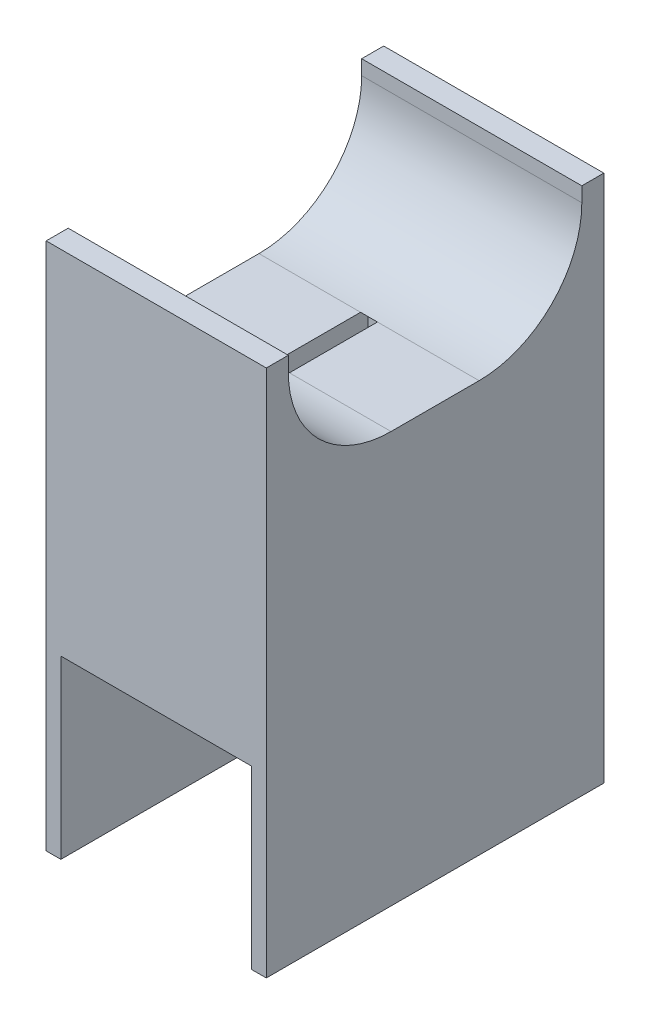
ISO-10303-21;
HEADER;
FILE_DESCRIPTION(('STEP AP214'),'2;1');
FILE_NAME('part.step','',(''),(''),'','','');
FILE_SCHEMA(('AUTOMOTIVE_DESIGN { 1 0 10303 214 1 1 1 1 }'));
ENDSEC;
DATA;
#1=APPLICATION_CONTEXT('core data for automotive mechanical design processes');
#2=APPLICATION_PROTOCOL_DEFINITION('international standard','automotive_design',2000,#1);
#3=PRODUCT_CONTEXT('',#1,'mechanical');
#4=PRODUCT('Part','Part','',(#3));
#5=PRODUCT_RELATED_PRODUCT_CATEGORY('part','',(#4));
#6=PRODUCT_DEFINITION_FORMATION('','',#4);
#7=PRODUCT_DEFINITION_CONTEXT('part definition',#1,'design');
#8=PRODUCT_DEFINITION('design','',#6,#7);
#9=PRODUCT_DEFINITION_SHAPE('','',#8);
#10=(LENGTH_UNIT() NAMED_UNIT(*) SI_UNIT(.MILLI.,.METRE.));
#11=(NAMED_UNIT(*) PLANE_ANGLE_UNIT() SI_UNIT($,.RADIAN.));
#12=(NAMED_UNIT(*) SI_UNIT($,.STERADIAN.) SOLID_ANGLE_UNIT());
#13=UNCERTAINTY_MEASURE_WITH_UNIT(LENGTH_MEASURE(1.E-05),#10,'distance_accuracy_value','');
#14=(GEOMETRIC_REPRESENTATION_CONTEXT(3) GLOBAL_UNCERTAINTY_ASSIGNED_CONTEXT((#13)) GLOBAL_UNIT_ASSIGNED_CONTEXT((#10,
#11,#12)) REPRESENTATION_CONTEXT('',''));
#15=CARTESIAN_POINT('',(0.,0.,0.));
#16=DIRECTION('',(0.,0.,1.));
#17=DIRECTION('',(1.,0.,0.));
#18=AXIS2_PLACEMENT_3D('',#15,#16,#17);
#19=CARTESIAN_POINT('',(-7.5,18.,10.));
#20=DIRECTION('',(0.,-1.,0.));
#21=DIRECTION('',(0.,0.,-1.));
#22=AXIS2_PLACEMENT_3D('',#19,#20,#21);
#23=PLANE('',#22);
#24=DIRECTION('',(1.,0.,0.));
#25=VECTOR('',#24,1.);
#26=CARTESIAN_POINT('',(-7.5,18.,-3.));
#27=LINE('',#26,#25);
#28=CARTESIAN_POINT('',(7.5,18.,-3.));
#29=VERTEX_POINT('',#28);
#30=CARTESIAN_POINT('',(0.575,18.,-3.));
#31=VERTEX_POINT('',#30);
#32=EDGE_CURVE('E363',#29,#31,#27,.F.);
#33=ORIENTED_EDGE('',*,*,#32,.T.);
#34=DIRECTION('',(0.,0.,1.));
#35=VECTOR('',#34,1.);
#36=CARTESIAN_POINT('',(0.575,18.,-3.5));
#37=LINE('',#36,#35);
#38=CARTESIAN_POINT('',(0.575,18.,3.));
#39=VERTEX_POINT('',#38);
#40=EDGE_CURVE('E189',#31,#39,#37,.T.);
#41=ORIENTED_EDGE('',*,*,#40,.T.);
#42=DIRECTION('',(1.,0.,0.));
#43=VECTOR('',#42,1.);
#44=CARTESIAN_POINT('',(7.5,18.,3.));
#45=LINE('',#44,#43);
#46=CARTESIAN_POINT('',(7.5,18.,3.));
#47=VERTEX_POINT('',#46);
#48=EDGE_CURVE('E357',#39,#47,#45,.T.);
#49=ORIENTED_EDGE('',*,*,#48,.T.);
#50=DIRECTION('',(0.,0.,-1.));
#51=VECTOR('',#50,1.);
#52=CARTESIAN_POINT('',(7.5,18.,10.));
#53=LINE('',#52,#51);
#54=EDGE_CURVE('E311',#47,#29,#53,.T.);
#55=ORIENTED_EDGE('',*,*,#54,.T.);
#56=EDGE_LOOP('',(#33,#41,#49,#55));
#57=FACE_BOUND('',#56,.T.);
#58=ADVANCED_FACE('F44',(#57),#23,.F.);
#59=CARTESIAN_POINT('',(0.,-10.,0.));
#60=DIRECTION('',(0.,1.,0.));
#61=DIRECTION('',(0.,0.,1.));
#62=AXIS2_PLACEMENT_3D('',#59,#60,#61);
#63=PLANE('',#62);
#64=DIRECTION('',(1.,0.,0.));
#65=VECTOR('',#64,1.);
#66=CARTESIAN_POINT('',(-7.5,-10.,-11.5));
#67=LINE('',#66,#65);
#68=CARTESIAN_POINT('',(-7.5,-10.,-11.5));
#69=VERTEX_POINT('',#68);
#70=CARTESIAN_POINT('',(-6.5,-10.,-11.5));
#71=VERTEX_POINT('',#70);
#72=EDGE_CURVE('E290',#69,#71,#67,.T.);
#73=ORIENTED_EDGE('',*,*,#72,.T.);
#74=DIRECTION('',(0.,0.,1.));
#75=VECTOR('',#74,1.);
#76=CARTESIAN_POINT('',(-6.5,-10.,-11.5));
#77=LINE('',#76,#75);
#78=CARTESIAN_POINT('',(-6.5,-10.,11.5));
#79=VERTEX_POINT('',#78);
#80=EDGE_CURVE('E254',#71,#79,#77,.T.);
#81=ORIENTED_EDGE('',*,*,#80,.T.);
#82=DIRECTION('',(-1.,0.,0.));
#83=VECTOR('',#82,1.);
#84=CARTESIAN_POINT('',(-7.5,-10.,11.5));
#85=LINE('',#84,#83);
#86=CARTESIAN_POINT('',(-7.5,-10.,11.5));
#87=VERTEX_POINT('',#86);
#88=EDGE_CURVE('E280',#79,#87,#85,.T.);
#89=ORIENTED_EDGE('',*,*,#88,.T.);
#90=DIRECTION('',(0.,0.,-1.));
#91=VECTOR('',#90,1.);
#92=CARTESIAN_POINT('',(-7.5,-10.,-11.5));
#93=LINE('',#92,#91);
#94=EDGE_CURVE('E285',#87,#69,#93,.T.);
#95=ORIENTED_EDGE('',*,*,#94,.T.);
#96=EDGE_LOOP('',(#73,#81,#89,#95));
#97=FACE_BOUND('',#96,.T.);
#98=ADVANCED_FACE('F410',(#97),#63,.F.);
#99=CARTESIAN_POINT('',(0.,26.,0.));
#100=DIRECTION('',(0.,-1.,0.));
#101=DIRECTION('',(0.,0.,-1.));
#102=AXIS2_PLACEMENT_3D('',#99,#100,#101);
#103=PLANE('',#102);
#104=DIRECTION('',(0.,0.,-1.));
#105=VECTOR('',#104,1.);
#106=CARTESIAN_POINT('',(7.5,26.,11.5));
#107=LINE('',#106,#105);
#108=CARTESIAN_POINT('',(7.5,26.,11.5));
#109=VERTEX_POINT('',#108);
#110=CARTESIAN_POINT('',(7.5,26.,10.));
#111=VERTEX_POINT('',#110);
#112=EDGE_CURVE('E324',#109,#111,#107,.T.);
#113=ORIENTED_EDGE('',*,*,#112,.T.);
#114=DIRECTION('',(1.,0.,0.));
#115=VECTOR('',#114,1.);
#116=CARTESIAN_POINT('',(-7.5,26.,10.));
#117=LINE('',#116,#115);
#118=CARTESIAN_POINT('',(-7.5,26.,10.));
#119=VERTEX_POINT('',#118);
#120=EDGE_CURVE('E317',#119,#111,#117,.T.);
#121=ORIENTED_EDGE('',*,*,#120,.F.);
#122=DIRECTION('',(0.,0.,1.));
#123=VECTOR('',#122,1.);
#124=CARTESIAN_POINT('',(-7.5,26.,11.5));
#125=LINE('',#124,#123);
#126=CARTESIAN_POINT('',(-7.5,26.,11.5));
#127=VERTEX_POINT('',#126);
#128=EDGE_CURVE('E331',#119,#127,#125,.T.);
#129=ORIENTED_EDGE('',*,*,#128,.T.);
#130=DIRECTION('',(1.,0.,0.));
#131=VECTOR('',#130,1.);
#132=CARTESIAN_POINT('',(-7.5,26.,11.5));
#133=LINE('',#132,#131);
#134=EDGE_CURVE('E336',#127,#109,#133,.T.);
#135=ORIENTED_EDGE('',*,*,#134,.T.);
#136=EDGE_LOOP('',(#113,#121,#129,#135));
#137=FACE_BOUND('',#136,.T.);
#138=ADVANCED_FACE('F443',(#137),#103,.F.);
#139=CARTESIAN_POINT('',(7.5,26.,11.5));
#140=DIRECTION('',(-1.,0.,0.));
#141=DIRECTION('',(0.,0.,1.));
#142=AXIS2_PLACEMENT_3D('',#139,#140,#141);
#143=PLANE('',#142);
#144=ORIENTED_EDGE('',*,*,#54,.F.);
#145=CARTESIAN_POINT('',(7.5,25.,3.));
#146=DIRECTION('',(-1.,0.,0.));
#147=DIRECTION('',(0.,0.,1.));
#148=AXIS2_PLACEMENT_3D('',#145,#146,#147);
#149=CIRCLE('',#148,7.);
#150=CARTESIAN_POINT('',(7.5,25.,10.));
#151=VERTEX_POINT('',#150);
#152=EDGE_CURVE('E53',#47,#151,#149,.T.);
#153=ORIENTED_EDGE('',*,*,#152,.T.);
#154=DIRECTION('',(0.,-1.,0.));
#155=VECTOR('',#154,1.);
#156=CARTESIAN_POINT('',(7.5,26.,10.));
#157=LINE('',#156,#155);
#158=EDGE_CURVE('E294',#111,#151,#157,.T.);
#159=ORIENTED_EDGE('',*,*,#158,.F.);
#160=ORIENTED_EDGE('',*,*,#112,.F.);
#161=DIRECTION('',(0.,-1.,0.));
#162=VECTOR('',#161,1.);
#163=CARTESIAN_POINT('',(7.5,26.,11.5));
#164=LINE('',#163,#162);
#165=CARTESIAN_POINT('',(7.5,-10.,11.5));
#166=VERTEX_POINT('',#165);
#167=EDGE_CURVE('E339',#109,#166,#164,.T.);
#168=ORIENTED_EDGE('',*,*,#167,.T.);
#169=DIRECTION('',(0.,0.,1.));
#170=VECTOR('',#169,1.);
#171=CARTESIAN_POINT('',(7.5,-10.,-11.5));
#172=LINE('',#171,#170);
#173=CARTESIAN_POINT('',(7.5,-10.,-11.5));
#174=VERTEX_POINT('',#173);
#175=EDGE_CURVE('E267',#174,#166,#172,.T.);
#176=ORIENTED_EDGE('',*,*,#175,.F.);
#177=DIRECTION('',(0.,-1.,0.));
#178=VECTOR('',#177,1.);
#179=CARTESIAN_POINT('',(7.5,26.,-11.5));
#180=LINE('',#179,#178);
#181=CARTESIAN_POINT('',(7.5,26.,-11.5));
#182=VERTEX_POINT('',#181);
#183=EDGE_CURVE('E349',#182,#174,#180,.T.);
#184=ORIENTED_EDGE('',*,*,#183,.F.);
#185=CARTESIAN_POINT('',(7.5,26.,-10.));
#186=VERTEX_POINT('',#185);
#187=EDGE_CURVE('E320',#186,#182,#107,.T.);
#188=ORIENTED_EDGE('',*,*,#187,.F.);
#189=DIRECTION('',(0.,1.,0.));
#190=VECTOR('',#189,1.);
#191=CARTESIAN_POINT('',(7.5,26.,-10.));
#192=LINE('',#191,#190);
#193=CARTESIAN_POINT('',(7.5,25.,-10.));
#194=VERTEX_POINT('',#193);
#195=EDGE_CURVE('E300',#194,#186,#192,.T.);
#196=ORIENTED_EDGE('',*,*,#195,.F.);
#197=CARTESIAN_POINT('',(7.5,25.,-3.));
#198=DIRECTION('',(-1.,0.,0.));
#199=DIRECTION('',(0.,0.,1.));
#200=AXIS2_PLACEMENT_3D('',#197,#198,#199);
#201=CIRCLE('',#200,7.);
#202=EDGE_CURVE('E370',#194,#29,#201,.T.);
#203=ORIENTED_EDGE('',*,*,#202,.T.);
#204=EDGE_LOOP('',(#144,#153,#159,#160,#168,#176,#184,#188,#196,#203));
#205=FACE_BOUND('',#204,.T.);
#206=ADVANCED_FACE('F380',(#205),#143,.F.);
#207=CARTESIAN_POINT('',(-7.5,26.,-11.5));
#208=DIRECTION('',(0.,0.,1.));
#209=DIRECTION('',(1.,0.,0.));
#210=AXIS2_PLACEMENT_3D('',#207,#208,#209);
#211=PLANE('',#210);
#212=DIRECTION('',(-1.,0.,0.));
#213=VECTOR('',#212,1.);
#214=CARTESIAN_POINT('',(-6.5,2.,-11.5));
#215=LINE('',#214,#213);
#216=CARTESIAN_POINT('',(6.5,2.,-11.5));
#217=VERTEX_POINT('',#216);
#218=CARTESIAN_POINT('',(-6.5,2.,-11.5));
#219=VERTEX_POINT('',#218);
#220=EDGE_CURVE('E250',#217,#219,#215,.T.);
#221=ORIENTED_EDGE('',*,*,#220,.T.);
#222=DIRECTION('',(0.,-1.,0.));
#223=VECTOR('',#222,1.);
#224=CARTESIAN_POINT('',(-6.5,-10.,-11.5));
#225=LINE('',#224,#223);
#226=EDGE_CURVE('E241',#219,#71,#225,.T.);
#227=ORIENTED_EDGE('',*,*,#226,.T.);
#228=ORIENTED_EDGE('',*,*,#72,.F.);
#229=DIRECTION('',(0.,-1.,0.));
#230=VECTOR('',#229,1.);
#231=CARTESIAN_POINT('',(-7.5,26.,-11.5));
#232=LINE('',#231,#230);
#233=CARTESIAN_POINT('',(-7.5,26.,-11.5));
#234=VERTEX_POINT('',#233);
#235=EDGE_CURVE('E346',#234,#69,#232,.T.);
#236=ORIENTED_EDGE('',*,*,#235,.F.);
#237=DIRECTION('',(-1.,0.,0.));
#238=VECTOR('',#237,1.);
#239=CARTESIAN_POINT('',(-7.5,26.,-11.5));
#240=LINE('',#239,#238);
#241=EDGE_CURVE('E328',#182,#234,#240,.T.);
#242=ORIENTED_EDGE('',*,*,#241,.F.);
#243=ORIENTED_EDGE('',*,*,#183,.T.);
#244=CARTESIAN_POINT('',(6.5,-10.,-11.5));
#245=VERTEX_POINT('',#244);
#246=EDGE_CURVE('E289',#245,#174,#67,.T.);
#247=ORIENTED_EDGE('',*,*,#246,.F.);
#248=DIRECTION('',(0.,1.,0.));
#249=VECTOR('',#248,1.);
#250=CARTESIAN_POINT('',(6.5,-10.,-11.5));
#251=LINE('',#250,#249);
#252=EDGE_CURVE('E245',#245,#217,#251,.T.);
#253=ORIENTED_EDGE('',*,*,#252,.T.);
#254=EDGE_LOOP('',(#221,#227,#228,#236,#242,#243,#247,#253));
#255=FACE_BOUND('',#254,.T.);
#256=ADVANCED_FACE('F423',(#255),#211,.F.);
#257=CARTESIAN_POINT('',(-7.5,26.,11.5));
#258=DIRECTION('',(1.,0.,0.));
#259=DIRECTION('',(0.,0.,-1.));
#260=AXIS2_PLACEMENT_3D('',#257,#258,#259);
#261=PLANE('',#260);
#262=ORIENTED_EDGE('',*,*,#128,.F.);
#263=DIRECTION('',(0.,-1.,0.));
#264=VECTOR('',#263,1.);
#265=CARTESIAN_POINT('',(-7.5,26.,10.));
#266=LINE('',#265,#264);
#267=CARTESIAN_POINT('',(-7.5,25.,10.));
#268=VERTEX_POINT('',#267);
#269=EDGE_CURVE('E295',#119,#268,#266,.T.);
#270=ORIENTED_EDGE('',*,*,#269,.T.);
#271=CARTESIAN_POINT('',(-7.5,25.,3.));
#272=DIRECTION('',(1.,0.,0.));
#273=DIRECTION('',(0.,0.,-1.));
#274=AXIS2_PLACEMENT_3D('',#271,#272,#273);
#275=CIRCLE('',#274,7.);
#276=CARTESIAN_POINT('',(-7.5,18.,3.));
#277=VERTEX_POINT('',#276);
#278=EDGE_CURVE('E11',#268,#277,#275,.T.);
#279=ORIENTED_EDGE('',*,*,#278,.T.);
#280=DIRECTION('',(0.,0.,-1.));
#281=VECTOR('',#280,1.);
#282=CARTESIAN_POINT('',(-7.5,18.,10.));
#283=LINE('',#282,#281);
#284=CARTESIAN_POINT('',(-7.5,18.,-3.));
#285=VERTEX_POINT('',#284);
#286=EDGE_CURVE('E299',#277,#285,#283,.T.);
#287=ORIENTED_EDGE('',*,*,#286,.T.);
#288=CARTESIAN_POINT('',(-7.5,25.,-3.));
#289=DIRECTION('',(1.,0.,0.));
#290=DIRECTION('',(0.,0.,-1.));
#291=AXIS2_PLACEMENT_3D('',#288,#289,#290);
#292=CIRCLE('',#291,7.);
#293=CARTESIAN_POINT('',(-7.5,25.,-10.));
#294=VERTEX_POINT('',#293);
#295=EDGE_CURVE('E373',#285,#294,#292,.T.);
#296=ORIENTED_EDGE('',*,*,#295,.T.);
#297=DIRECTION('',(0.,1.,0.));
#298=VECTOR('',#297,1.);
#299=CARTESIAN_POINT('',(-7.5,26.,-10.));
#300=LINE('',#299,#298);
#301=CARTESIAN_POINT('',(-7.5,26.,-10.));
#302=VERTEX_POINT('',#301);
#303=EDGE_CURVE('E304',#294,#302,#300,.T.);
#304=ORIENTED_EDGE('',*,*,#303,.T.);
#305=EDGE_CURVE('E332',#234,#302,#125,.T.);
#306=ORIENTED_EDGE('',*,*,#305,.F.);
#307=ORIENTED_EDGE('',*,*,#235,.T.);
#308=ORIENTED_EDGE('',*,*,#94,.F.);
#309=DIRECTION('',(0.,-1.,0.));
#310=VECTOR('',#309,1.);
#311=CARTESIAN_POINT('',(-7.5,26.,11.5));
#312=LINE('',#311,#310);
#313=EDGE_CURVE('E342',#127,#87,#312,.T.);
#314=ORIENTED_EDGE('',*,*,#313,.F.);
#315=EDGE_LOOP('',(#262,#270,#279,#287,#296,#304,#306,#307,#308,#314));
#316=FACE_BOUND('',#315,.T.);
#317=ADVANCED_FACE('F393',(#316),#261,.F.);
#318=CARTESIAN_POINT('',(-7.5,26.,11.5));
#319=DIRECTION('',(0.,0.,-1.));
#320=DIRECTION('',(-1.,0.,0.));
#321=AXIS2_PLACEMENT_3D('',#318,#319,#320);
#322=PLANE('',#321);
#323=ORIENTED_EDGE('',*,*,#88,.F.);
#324=DIRECTION('',(0.,-1.,0.));
#325=VECTOR('',#324,1.);
#326=CARTESIAN_POINT('',(-6.5,-10.,11.5));
#327=LINE('',#326,#325);
#328=CARTESIAN_POINT('',(-6.5,2.,11.5));
#329=VERTEX_POINT('',#328);
#330=EDGE_CURVE('E240',#329,#79,#327,.T.);
#331=ORIENTED_EDGE('',*,*,#330,.F.);
#332=DIRECTION('',(-1.,0.,0.));
#333=VECTOR('',#332,1.);
#334=CARTESIAN_POINT('',(-6.5,2.,11.5));
#335=LINE('',#334,#333);
#336=CARTESIAN_POINT('',(6.5,2.,11.5));
#337=VERTEX_POINT('',#336);
#338=EDGE_CURVE('E246',#337,#329,#335,.T.);
#339=ORIENTED_EDGE('',*,*,#338,.F.);
#340=DIRECTION('',(0.,1.,0.));
#341=VECTOR('',#340,1.);
#342=CARTESIAN_POINT('',(6.5,-10.,11.5));
#343=LINE('',#342,#341);
#344=CARTESIAN_POINT('',(6.5,-10.,11.5));
#345=VERTEX_POINT('',#344);
#346=EDGE_CURVE('E257',#345,#337,#343,.T.);
#347=ORIENTED_EDGE('',*,*,#346,.F.);
#348=EDGE_CURVE('E281',#166,#345,#85,.T.);
#349=ORIENTED_EDGE('',*,*,#348,.F.);
#350=ORIENTED_EDGE('',*,*,#167,.F.);
#351=ORIENTED_EDGE('',*,*,#134,.F.);
#352=ORIENTED_EDGE('',*,*,#313,.T.);
#353=EDGE_LOOP('',(#323,#331,#339,#347,#349,#350,#351,#352));
#354=FACE_BOUND('',#353,.T.);
#355=ADVANCED_FACE('F417',(#354),#322,.F.);
#356=ORIENTED_EDGE('',*,*,#305,.T.);
#357=DIRECTION('',(1.,0.,0.));
#358=VECTOR('',#357,1.);
#359=CARTESIAN_POINT('',(-7.5,26.,-10.));
#360=LINE('',#359,#358);
#361=EDGE_CURVE('E307',#302,#186,#360,.T.);
#362=ORIENTED_EDGE('',*,*,#361,.T.);
#363=ORIENTED_EDGE('',*,*,#187,.T.);
#364=ORIENTED_EDGE('',*,*,#241,.T.);
#365=EDGE_LOOP('',(#356,#362,#363,#364));
#366=FACE_BOUND('',#365,.T.);
#367=ADVANCED_FACE('F446',(#366),#103,.F.);
#368=CARTESIAN_POINT('',(-7.5,26.,10.));
#369=DIRECTION('',(0.,0.,1.));
#370=DIRECTION('',(0.,-1.,0.));
#371=AXIS2_PLACEMENT_3D('',#368,#369,#370);
#372=PLANE('',#371);
#373=ORIENTED_EDGE('',*,*,#158,.T.);
#374=DIRECTION('',(1.,0.,0.));
#375=VECTOR('',#374,1.);
#376=CARTESIAN_POINT('',(-7.5,25.,10.));
#377=LINE('',#376,#375);
#378=EDGE_CURVE('E367',#151,#268,#377,.F.);
#379=ORIENTED_EDGE('',*,*,#378,.T.);
#380=ORIENTED_EDGE('',*,*,#269,.F.);
#381=ORIENTED_EDGE('',*,*,#120,.T.);
#382=EDGE_LOOP('',(#373,#379,#380,#381));
#383=FACE_BOUND('',#382,.T.);
#384=ADVANCED_FACE('F386',(#383),#372,.F.);
#385=CARTESIAN_POINT('',(-7.5,26.,-10.));
#386=DIRECTION('',(0.,0.,-1.));
#387=DIRECTION('',(0.,1.,0.));
#388=AXIS2_PLACEMENT_3D('',#385,#386,#387);
#389=PLANE('',#388);
#390=ORIENTED_EDGE('',*,*,#303,.F.);
#391=DIRECTION('',(1.,0.,0.));
#392=VECTOR('',#391,1.);
#393=CARTESIAN_POINT('',(7.5,25.,-10.));
#394=LINE('',#393,#392);
#395=EDGE_CURVE('E353',#294,#194,#394,.T.);
#396=ORIENTED_EDGE('',*,*,#395,.T.);
#397=ORIENTED_EDGE('',*,*,#195,.T.);
#398=ORIENTED_EDGE('',*,*,#361,.F.);
#399=EDGE_LOOP('',(#390,#396,#397,#398));
#400=FACE_BOUND('',#399,.T.);
#401=ADVANCED_FACE('F466',(#400),#389,.F.);
#402=CARTESIAN_POINT('',(-0.575000000000001,18.,3.));
#403=VERTEX_POINT('',#402);
#404=EDGE_CURVE('E358',#277,#403,#45,.T.);
#405=ORIENTED_EDGE('',*,*,#404,.T.);
#406=DIRECTION('',(0.,0.,-1.));
#407=VECTOR('',#406,1.);
#408=CARTESIAN_POINT('',(-0.575,18.,-3.5));
#409=LINE('',#408,#407);
#410=CARTESIAN_POINT('',(-0.575,18.,-3.));
#411=VERTEX_POINT('',#410);
#412=EDGE_CURVE('E208',#403,#411,#409,.T.);
#413=ORIENTED_EDGE('',*,*,#412,.T.);
#414=EDGE_CURVE('E362',#411,#285,#27,.F.);
#415=ORIENTED_EDGE('',*,*,#414,.T.);
#416=ORIENTED_EDGE('',*,*,#286,.F.);
#417=EDGE_LOOP('',(#405,#413,#415,#416));
#418=FACE_BOUND('',#417,.T.);
#419=ADVANCED_FACE('F396',(#418),#23,.F.);
#420=CARTESIAN_POINT('',(-7.5,25.,-3.));
#421=DIRECTION('',(-1.,0.,0.));
#422=DIRECTION('',(0.,0.,1.));
#423=AXIS2_PLACEMENT_3D('',#420,#421,#422);
#424=CYLINDRICAL_SURFACE('',#423,7.);
#425=ORIENTED_EDGE('',*,*,#295,.F.);
#426=ORIENTED_EDGE('',*,*,#414,.F.);
#427=DIRECTION('',(-1.,0.,0.));
#428=VECTOR('',#427,1.);
#429=CARTESIAN_POINT('',(-7.5,18.,-3.));
#430=LINE('',#429,#428);
#431=EDGE_CURVE('E231',#411,#31,#430,.F.);
#432=ORIENTED_EDGE('',*,*,#431,.T.);
#433=ORIENTED_EDGE('',*,*,#32,.F.);
#434=ORIENTED_EDGE('',*,*,#202,.F.);
#435=ORIENTED_EDGE('',*,*,#395,.F.);
#436=EDGE_LOOP('',(#425,#426,#432,#433,#434,#435));
#437=FACE_BOUND('',#436,.T.);
#438=ADVANCED_FACE('F465',(#437),#424,.F.);
#439=CARTESIAN_POINT('',(-7.5,25.,3.));
#440=DIRECTION('',(-1.,0.,0.));
#441=DIRECTION('',(0.,0.,1.));
#442=AXIS2_PLACEMENT_3D('',#439,#440,#441);
#443=CYLINDRICAL_SURFACE('',#442,7.);
#444=ORIENTED_EDGE('',*,*,#278,.F.);
#445=ORIENTED_EDGE('',*,*,#378,.F.);
#446=ORIENTED_EDGE('',*,*,#152,.F.);
#447=ORIENTED_EDGE('',*,*,#48,.F.);
#448=EDGE_CURVE('E186',#403,#39,#45,.T.);
#449=ORIENTED_EDGE('',*,*,#448,.F.);
#450=ORIENTED_EDGE('',*,*,#404,.F.);
#451=EDGE_LOOP('',(#444,#445,#446,#447,#449,#450));
#452=FACE_BOUND('',#451,.T.);
#453=ADVANCED_FACE('F46',(#452),#443,.F.);
#454=ORIENTED_EDGE('',*,*,#348,.T.);
#455=DIRECTION('',(0.,0.,1.));
#456=VECTOR('',#455,1.);
#457=CARTESIAN_POINT('',(6.5,-10.,-11.5));
#458=LINE('',#457,#456);
#459=EDGE_CURVE('E271',#245,#345,#458,.T.);
#460=ORIENTED_EDGE('',*,*,#459,.F.);
#461=ORIENTED_EDGE('',*,*,#246,.T.);
#462=ORIENTED_EDGE('',*,*,#175,.T.);
#463=EDGE_LOOP('',(#454,#460,#461,#462));
#464=FACE_BOUND('',#463,.T.);
#465=ADVANCED_FACE('F439',(#464),#63,.F.);
#466=CARTESIAN_POINT('',(-6.5,-10.,-11.5));
#467=DIRECTION('',(-1.,0.,0.));
#468=DIRECTION('',(0.,-1.,0.));
#469=AXIS2_PLACEMENT_3D('',#466,#467,#468);
#470=PLANE('',#469);
#471=ORIENTED_EDGE('',*,*,#330,.T.);
#472=ORIENTED_EDGE('',*,*,#80,.F.);
#473=ORIENTED_EDGE('',*,*,#226,.F.);
#474=DIRECTION('',(0.,0.,1.));
#475=VECTOR('',#474,1.);
#476=CARTESIAN_POINT('',(-6.5,2.,-11.5));
#477=LINE('',#476,#475);
#478=EDGE_CURVE('E264',#219,#329,#477,.T.);
#479=ORIENTED_EDGE('',*,*,#478,.T.);
#480=EDGE_LOOP('',(#471,#472,#473,#479));
#481=FACE_BOUND('',#480,.T.);
#482=ADVANCED_FACE('F428',(#481),#470,.F.);
#483=CARTESIAN_POINT('',(-6.5,2.,-11.5));
#484=DIRECTION('',(0.,1.,0.));
#485=DIRECTION('',(0.,0.,1.));
#486=AXIS2_PLACEMENT_3D('',#483,#484,#485);
#487=PLANE('',#486);
#488=DIRECTION('',(-1.,0.,0.));
#489=VECTOR('',#488,1.);
#490=CARTESIAN_POINT('',(-0.575,2.,3.5));
#491=LINE('',#490,#489);
#492=CARTESIAN_POINT('',(0.575,2.,3.5));
#493=VERTEX_POINT('',#492);
#494=CARTESIAN_POINT('',(-0.575,2.,3.5));
#495=VERTEX_POINT('',#494);
#496=EDGE_CURVE('E218',#493,#495,#491,.T.);
#497=ORIENTED_EDGE('',*,*,#496,.F.);
#498=DIRECTION('',(0.,0.,1.));
#499=VECTOR('',#498,1.);
#500=CARTESIAN_POINT('',(0.575,2.,-3.5));
#501=LINE('',#500,#499);
#502=CARTESIAN_POINT('',(0.575,2.,-3.5));
#503=VERTEX_POINT('',#502);
#504=EDGE_CURVE('E68',#503,#493,#501,.T.);
#505=ORIENTED_EDGE('',*,*,#504,.F.);
#506=DIRECTION('',(1.,0.,0.));
#507=VECTOR('',#506,1.);
#508=CARTESIAN_POINT('',(-0.575,2.,-3.5));
#509=LINE('',#508,#507);
#510=CARTESIAN_POINT('',(-0.575,2.,-3.5));
#511=VERTEX_POINT('',#510);
#512=EDGE_CURVE('E190',#511,#503,#509,.T.);
#513=ORIENTED_EDGE('',*,*,#512,.F.);
#514=DIRECTION('',(0.,0.,-1.));
#515=VECTOR('',#514,1.);
#516=CARTESIAN_POINT('',(-0.575,2.,-3.5));
#517=LINE('',#516,#515);
#518=EDGE_CURVE('E221',#495,#511,#517,.T.);
#519=ORIENTED_EDGE('',*,*,#518,.F.);
#520=EDGE_LOOP('',(#497,#505,#513,#519));
#521=FACE_BOUND('',#520,.T.);
#522=ORIENTED_EDGE('',*,*,#338,.T.);
#523=ORIENTED_EDGE('',*,*,#478,.F.);
#524=ORIENTED_EDGE('',*,*,#220,.F.);
#525=DIRECTION('',(0.,0.,1.));
#526=VECTOR('',#525,1.);
#527=CARTESIAN_POINT('',(6.5,2.,-11.5));
#528=LINE('',#527,#526);
#529=EDGE_CURVE('E268',#217,#337,#528,.T.);
#530=ORIENTED_EDGE('',*,*,#529,.T.);
#531=EDGE_LOOP('',(#522,#523,#524,#530));
#532=FACE_BOUND('',#531,.T.);
#533=ADVANCED_FACE('F433',(#521,#532),#487,.F.);
#534=CARTESIAN_POINT('',(6.5,-10.,-11.5));
#535=DIRECTION('',(1.,0.,0.));
#536=DIRECTION('',(0.,1.,0.));
#537=AXIS2_PLACEMENT_3D('',#534,#535,#536);
#538=PLANE('',#537);
#539=ORIENTED_EDGE('',*,*,#346,.T.);
#540=ORIENTED_EDGE('',*,*,#529,.F.);
#541=ORIENTED_EDGE('',*,*,#252,.F.);
#542=ORIENTED_EDGE('',*,*,#459,.T.);
#543=EDGE_LOOP('',(#539,#540,#541,#542));
#544=FACE_BOUND('',#543,.T.);
#545=ADVANCED_FACE('F435',(#544),#538,.F.);
#546=CARTESIAN_POINT('',(0.,18.,0.));
#547=DIRECTION('',(0.,1.,0.));
#548=DIRECTION('',(0.,0.,1.));
#549=AXIS2_PLACEMENT_3D('',#546,#547,#548);
#550=PLANE('',#549);
#551=CARTESIAN_POINT('',(-0.575,18.,-3.5));
#552=VERTEX_POINT('',#551);
#553=EDGE_CURVE('E204',#411,#552,#409,.T.);
#554=ORIENTED_EDGE('',*,*,#553,.T.);
#555=DIRECTION('',(1.,0.,0.));
#556=VECTOR('',#555,1.);
#557=CARTESIAN_POINT('',(-0.575,18.,-3.5));
#558=LINE('',#557,#556);
#559=CARTESIAN_POINT('',(0.575,18.,-3.5));
#560=VERTEX_POINT('',#559);
#561=EDGE_CURVE('E200',#552,#560,#558,.T.);
#562=ORIENTED_EDGE('',*,*,#561,.T.);
#563=EDGE_CURVE('E192',#560,#31,#37,.T.);
#564=ORIENTED_EDGE('',*,*,#563,.T.);
#565=ORIENTED_EDGE('',*,*,#431,.F.);
#566=EDGE_LOOP('',(#554,#562,#564,#565));
#567=FACE_BOUND('',#566,.T.);
#568=ADVANCED_FACE('F481',(#567),#550,.F.);
#569=CARTESIAN_POINT('',(0.575,18.,-3.5));
#570=DIRECTION('',(1.,0.,0.));
#571=DIRECTION('',(0.,0.,-1.));
#572=AXIS2_PLACEMENT_3D('',#569,#570,#571);
#573=PLANE('',#572);
#574=ORIENTED_EDGE('',*,*,#504,.T.);
#575=DIRECTION('',(0.,-1.,0.));
#576=VECTOR('',#575,1.);
#577=CARTESIAN_POINT('',(0.575,18.,3.5));
#578=LINE('',#577,#576);
#579=CARTESIAN_POINT('',(0.575,18.,3.5));
#580=VERTEX_POINT('',#579);
#581=EDGE_CURVE('E193',#580,#493,#578,.T.);
#582=ORIENTED_EDGE('',*,*,#581,.F.);
#583=EDGE_CURVE('E181',#39,#580,#37,.T.);
#584=ORIENTED_EDGE('',*,*,#583,.F.);
#585=ORIENTED_EDGE('',*,*,#40,.F.);
#586=ORIENTED_EDGE('',*,*,#563,.F.);
#587=DIRECTION('',(0.,-1.,0.));
#588=VECTOR('',#587,1.);
#589=CARTESIAN_POINT('',(0.575,18.,-3.5));
#590=LINE('',#589,#588);
#591=EDGE_CURVE('E228',#560,#503,#590,.T.);
#592=ORIENTED_EDGE('',*,*,#591,.T.);
#593=EDGE_LOOP('',(#574,#582,#584,#585,#586,#592));
#594=FACE_BOUND('',#593,.T.);
#595=ADVANCED_FACE('F194',(#594),#573,.F.);
#596=CARTESIAN_POINT('',(-0.575,18.,-3.5));
#597=DIRECTION('',(0.,0.,-1.));
#598=DIRECTION('',(-1.,0.,0.));
#599=AXIS2_PLACEMENT_3D('',#596,#597,#598);
#600=PLANE('',#599);
#601=ORIENTED_EDGE('',*,*,#512,.T.);
#602=ORIENTED_EDGE('',*,*,#591,.F.);
#603=ORIENTED_EDGE('',*,*,#561,.F.);
#604=DIRECTION('',(0.,-1.,0.));
#605=VECTOR('',#604,1.);
#606=CARTESIAN_POINT('',(-0.575,18.,-3.5));
#607=LINE('',#606,#605);
#608=EDGE_CURVE('E232',#552,#511,#607,.T.);
#609=ORIENTED_EDGE('',*,*,#608,.T.);
#610=EDGE_LOOP('',(#601,#602,#603,#609));
#611=FACE_BOUND('',#610,.T.);
#612=ADVANCED_FACE('F487',(#611),#600,.F.);
#613=CARTESIAN_POINT('',(-0.575,18.,-3.5));
#614=DIRECTION('',(-1.,0.,0.));
#615=DIRECTION('',(0.,0.,1.));
#616=AXIS2_PLACEMENT_3D('',#613,#614,#615);
#617=PLANE('',#616);
#618=ORIENTED_EDGE('',*,*,#518,.T.);
#619=ORIENTED_EDGE('',*,*,#608,.F.);
#620=ORIENTED_EDGE('',*,*,#553,.F.);
#621=ORIENTED_EDGE('',*,*,#412,.F.);
#622=CARTESIAN_POINT('',(-0.575,18.,3.5));
#623=VERTEX_POINT('',#622);
#624=EDGE_CURVE('E60',#623,#403,#409,.T.);
#625=ORIENTED_EDGE('',*,*,#624,.F.);
#626=DIRECTION('',(0.,-1.,0.));
#627=VECTOR('',#626,1.);
#628=CARTESIAN_POINT('',(-0.575,18.,3.5));
#629=LINE('',#628,#627);
#630=EDGE_CURVE('E199',#623,#495,#629,.T.);
#631=ORIENTED_EDGE('',*,*,#630,.T.);
#632=EDGE_LOOP('',(#618,#619,#620,#621,#625,#631));
#633=FACE_BOUND('',#632,.T.);
#634=ADVANCED_FACE('F490',(#633),#617,.F.);
#635=CARTESIAN_POINT('',(-0.575,18.,3.5));
#636=DIRECTION('',(0.,0.,1.));
#637=DIRECTION('',(1.,0.,0.));
#638=AXIS2_PLACEMENT_3D('',#635,#636,#637);
#639=PLANE('',#638);
#640=ORIENTED_EDGE('',*,*,#496,.T.);
#641=ORIENTED_EDGE('',*,*,#630,.F.);
#642=DIRECTION('',(-1.,0.,0.));
#643=VECTOR('',#642,1.);
#644=CARTESIAN_POINT('',(-0.575,18.,3.5));
#645=LINE('',#644,#643);
#646=EDGE_CURVE('E184',#580,#623,#645,.T.);
#647=ORIENTED_EDGE('',*,*,#646,.F.);
#648=ORIENTED_EDGE('',*,*,#581,.T.);
#649=EDGE_LOOP('',(#640,#641,#647,#648));
#650=FACE_BOUND('',#649,.T.);
#651=ADVANCED_FACE('F202',(#650),#639,.F.);
#652=ORIENTED_EDGE('',*,*,#448,.T.);
#653=ORIENTED_EDGE('',*,*,#583,.T.);
#654=ORIENTED_EDGE('',*,*,#646,.T.);
#655=ORIENTED_EDGE('',*,*,#624,.T.);
#656=EDGE_LOOP('',(#652,#653,#654,#655));
#657=FACE_BOUND('',#656,.T.);
#658=ADVANCED_FACE('F182',(#657),#550,.F.);
#659=CLOSED_SHELL('',(#58,#98,#138,#206,#256,#317,#355,#367,#384,#401,#419,#438,#453,#465,#482,
#533,#545,#568,#595,#612,#634,#651,#658));
#660=MANIFOLD_SOLID_BREP('B2',#659);
#661=ADVANCED_BREP_SHAPE_REPRESENTATION('',(#18,#660),#14);
#662=SHAPE_DEFINITION_REPRESENTATION(#9,#661);
ENDSEC;
END-ISO-10303-21;
